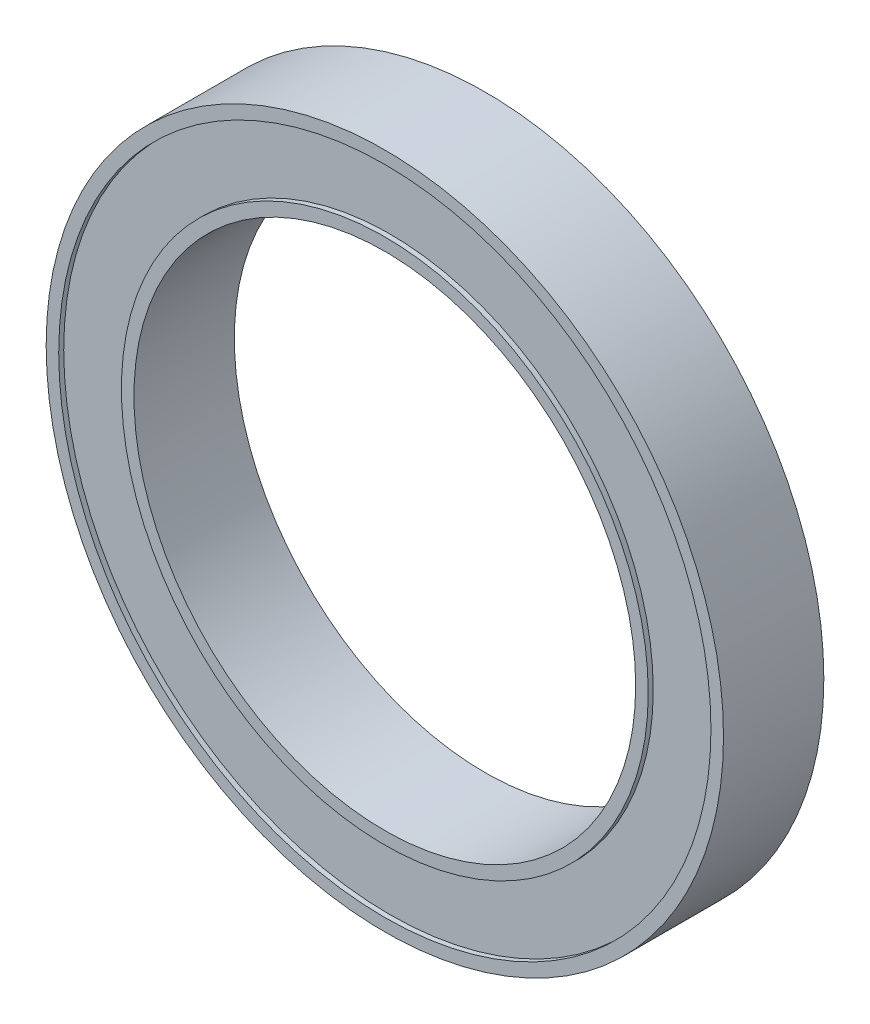
ISO-10303-21;
HEADER;
FILE_DESCRIPTION(('STEP AP214'),'2;1');
FILE_NAME('part.step','',(''),(''),'','','');
FILE_SCHEMA(('AUTOMOTIVE_DESIGN { 1 0 10303 214 1 1 1 1 }'));
ENDSEC;
DATA;
#1=APPLICATION_CONTEXT('core data for automotive mechanical design processes');
#2=APPLICATION_PROTOCOL_DEFINITION('international standard','automotive_design',2000,#1);
#3=PRODUCT_CONTEXT('',#1,'mechanical');
#4=PRODUCT('Part','Part','',(#3));
#5=PRODUCT_RELATED_PRODUCT_CATEGORY('part','',(#4));
#6=PRODUCT_DEFINITION_FORMATION('','',#4);
#7=PRODUCT_DEFINITION_CONTEXT('part definition',#1,'design');
#8=PRODUCT_DEFINITION('design','',#6,#7);
#9=PRODUCT_DEFINITION_SHAPE('','',#8);
#10=(LENGTH_UNIT() NAMED_UNIT(*) SI_UNIT(.MILLI.,.METRE.));
#11=(NAMED_UNIT(*) PLANE_ANGLE_UNIT() SI_UNIT($,.RADIAN.));
#12=(NAMED_UNIT(*) SI_UNIT($,.STERADIAN.) SOLID_ANGLE_UNIT());
#13=UNCERTAINTY_MEASURE_WITH_UNIT(LENGTH_MEASURE(1.E-05),#10,'distance_accuracy_value','');
#14=(GEOMETRIC_REPRESENTATION_CONTEXT(3) GLOBAL_UNCERTAINTY_ASSIGNED_CONTEXT((#13)) GLOBAL_UNIT_ASSIGNED_CONTEXT((#10,
#11,#12)) REPRESENTATION_CONTEXT('',''));
#15=CARTESIAN_POINT('',(0.,0.,0.));
#16=DIRECTION('',(0.,0.,1.));
#17=DIRECTION('',(1.,0.,0.));
#18=AXIS2_PLACEMENT_3D('',#15,#16,#17);
#19=CARTESIAN_POINT('',(0.,0.,4.));
#20=DIRECTION('',(0.,0.,-1.));
#21=DIRECTION('',(-1.,0.,0.));
#22=AXIS2_PLACEMENT_3D('',#19,#20,#21);
#23=CYLINDRICAL_SURFACE('',#22,10.5);
#24=CARTESIAN_POINT('',(0.,0.,0.));
#25=DIRECTION('',(0.,0.,1.));
#26=DIRECTION('',(1.,0.,0.));
#27=AXIS2_PLACEMENT_3D('',#24,#25,#26);
#28=CIRCLE('',#27,10.5);
#29=CARTESIAN_POINT('',(10.5,0.,0.));
#30=VERTEX_POINT('',#29);
#31=EDGE_CURVE('E53',#30,#30,#28,.T.);
#32=ORIENTED_EDGE('',*,*,#31,.T.);
#33=EDGE_LOOP('',(#32));
#34=FACE_BOUND('',#33,.T.);
#35=CARTESIAN_POINT('',(0.,0.,0.2));
#36=DIRECTION('',(0.,0.,1.));
#37=DIRECTION('',(1.,0.,0.));
#38=AXIS2_PLACEMENT_3D('',#35,#36,#37);
#39=CIRCLE('',#38,10.5);
#40=CARTESIAN_POINT('',(10.5,0.,0.2));
#41=VERTEX_POINT('',#40);
#42=EDGE_CURVE('E11',#41,#41,#39,.T.);
#43=ORIENTED_EDGE('',*,*,#42,.F.);
#44=EDGE_LOOP('',(#43));
#45=FACE_BOUND('',#44,.T.);
#46=ADVANCED_FACE('F37',(#34,#45),#23,.T.);
#47=CARTESIAN_POINT('',(0.,0.,4.));
#48=DIRECTION('',(0.,0.,-1.));
#49=DIRECTION('',(-1.,0.,0.));
#50=AXIS2_PLACEMENT_3D('',#47,#48,#49);
#51=CYLINDRICAL_SURFACE('',#50,10.);
#52=CARTESIAN_POINT('',(0.,0.,4.));
#53=DIRECTION('',(0.,0.,1.));
#54=DIRECTION('',(1.,0.,0.));
#55=AXIS2_PLACEMENT_3D('',#52,#53,#54);
#56=CIRCLE('',#55,10.);
#57=CARTESIAN_POINT('',(10.,0.,4.));
#58=VERTEX_POINT('',#57);
#59=EDGE_CURVE('E48',#58,#58,#56,.T.);
#60=ORIENTED_EDGE('',*,*,#59,.T.);
#61=EDGE_LOOP('',(#60));
#62=FACE_BOUND('',#61,.T.);
#63=CARTESIAN_POINT('',(0.,0.,0.));
#64=DIRECTION('',(0.,0.,1.));
#65=DIRECTION('',(1.,0.,0.));
#66=AXIS2_PLACEMENT_3D('',#63,#64,#65);
#67=CIRCLE('',#66,10.);
#68=CARTESIAN_POINT('',(10.,0.,0.));
#69=VERTEX_POINT('',#68);
#70=EDGE_CURVE('E57',#69,#69,#67,.T.);
#71=ORIENTED_EDGE('',*,*,#70,.F.);
#72=EDGE_LOOP('',(#71));
#73=FACE_BOUND('',#72,.T.);
#74=ADVANCED_FACE('F39',(#62,#73),#51,.F.);
#75=CARTESIAN_POINT('',(0.,0.,3.8));
#76=DIRECTION('',(0.,0.,1.));
#77=DIRECTION('',(1.,0.,0.));
#78=AXIS2_PLACEMENT_3D('',#75,#76,#77);
#79=CIRCLE('',#78,10.5);
#80=CARTESIAN_POINT('',(10.5,0.,3.8));
#81=VERTEX_POINT('',#80);
#82=EDGE_CURVE('E59',#81,#81,#79,.T.);
#83=ORIENTED_EDGE('',*,*,#82,.T.);
#84=EDGE_LOOP('',(#83));
#85=FACE_BOUND('',#84,.T.);
#86=CARTESIAN_POINT('',(0.,0.,4.));
#87=DIRECTION('',(0.,0.,1.));
#88=DIRECTION('',(1.,0.,0.));
#89=AXIS2_PLACEMENT_3D('',#86,#87,#88);
#90=CIRCLE('',#89,10.5);
#91=CARTESIAN_POINT('',(10.5,0.,4.));
#92=VERTEX_POINT('',#91);
#93=EDGE_CURVE('E44',#92,#92,#90,.T.);
#94=ORIENTED_EDGE('',*,*,#93,.F.);
#95=EDGE_LOOP('',(#94));
#96=FACE_BOUND('',#95,.T.);
#97=ADVANCED_FACE('F78',(#85,#96),#23,.T.);
#98=CARTESIAN_POINT('',(0.,0.,4.));
#99=DIRECTION('',(0.,0.,1.));
#100=DIRECTION('',(1.,0.,0.));
#101=AXIS2_PLACEMENT_3D('',#98,#99,#100);
#102=PLANE('',#101);
#103=ORIENTED_EDGE('',*,*,#59,.F.);
#104=EDGE_LOOP('',(#103));
#105=FACE_BOUND('',#104,.T.);
#106=ORIENTED_EDGE('',*,*,#93,.T.);
#107=EDGE_LOOP('',(#106));
#108=FACE_BOUND('',#107,.T.);
#109=ADVANCED_FACE('F68',(#105,#108),#102,.T.);
#110=CARTESIAN_POINT('',(0.,0.,0.));
#111=DIRECTION('',(0.,0.,1.));
#112=DIRECTION('',(1.,0.,0.));
#113=AXIS2_PLACEMENT_3D('',#110,#111,#112);
#114=PLANE('',#113);
#115=ORIENTED_EDGE('',*,*,#70,.T.);
#116=EDGE_LOOP('',(#115));
#117=FACE_BOUND('',#116,.T.);
#118=ORIENTED_EDGE('',*,*,#31,.F.);
#119=EDGE_LOOP('',(#118));
#120=FACE_BOUND('',#119,.T.);
#121=ADVANCED_FACE('F65',(#117,#120),#114,.F.);
#122=CARTESIAN_POINT('',(0.,0.,3.8));
#123=DIRECTION('',(0.,0.,1.));
#124=DIRECTION('',(1.,0.,0.));
#125=AXIS2_PLACEMENT_3D('',#122,#123,#124);
#126=PLANE('',#125);
#127=ORIENTED_EDGE('',*,*,#82,.F.);
#128=EDGE_LOOP('',(#127));
#129=FACE_BOUND('',#128,.T.);
#130=CARTESIAN_POINT('',(0.,0.,3.8));
#131=DIRECTION('',(0.,0.,1.));
#132=DIRECTION('',(1.,0.,0.));
#133=AXIS2_PLACEMENT_3D('',#130,#131,#132);
#134=CIRCLE('',#133,13.);
#135=CARTESIAN_POINT('',(13.,0.,3.8));
#136=VERTEX_POINT('',#135);
#137=EDGE_CURVE('E96',#136,#136,#134,.F.);
#138=ORIENTED_EDGE('',*,*,#137,.F.);
#139=EDGE_LOOP('',(#138));
#140=FACE_BOUND('',#139,.T.);
#141=ADVANCED_FACE('F67',(#129,#140),#126,.T.);
#142=CARTESIAN_POINT('',(0.,0.,0.2));
#143=DIRECTION('',(0.,0.,1.));
#144=DIRECTION('',(1.,0.,0.));
#145=AXIS2_PLACEMENT_3D('',#142,#143,#144);
#146=PLANE('',#145);
#147=ORIENTED_EDGE('',*,*,#42,.T.);
#148=EDGE_LOOP('',(#147));
#149=FACE_BOUND('',#148,.T.);
#150=CARTESIAN_POINT('',(0.,0.,0.2));
#151=DIRECTION('',(0.,0.,1.));
#152=DIRECTION('',(1.,0.,0.));
#153=AXIS2_PLACEMENT_3D('',#150,#151,#152);
#154=CIRCLE('',#153,13.);
#155=CARTESIAN_POINT('',(13.,0.,0.2));
#156=VERTEX_POINT('',#155);
#157=EDGE_CURVE('E93',#156,#156,#154,.T.);
#158=ORIENTED_EDGE('',*,*,#157,.F.);
#159=EDGE_LOOP('',(#158));
#160=FACE_BOUND('',#159,.T.);
#161=ADVANCED_FACE('F75',(#149,#160),#146,.F.);
#162=CARTESIAN_POINT('',(0.,0.,4.));
#163=DIRECTION('',(0.,0.,-1.));
#164=DIRECTION('',(-1.,0.,0.));
#165=AXIS2_PLACEMENT_3D('',#162,#163,#164);
#166=CYLINDRICAL_SURFACE('',#165,13.);
#167=CARTESIAN_POINT('',(0.,0.,0.));
#168=DIRECTION('',(0.,0.,1.));
#169=DIRECTION('',(1.,0.,0.));
#170=AXIS2_PLACEMENT_3D('',#167,#168,#169);
#171=CIRCLE('',#170,13.);
#172=CARTESIAN_POINT('',(13.,0.,0.));
#173=VERTEX_POINT('',#172);
#174=EDGE_CURVE('E105',#173,#173,#171,.T.);
#175=ORIENTED_EDGE('',*,*,#174,.F.);
#176=EDGE_LOOP('',(#175));
#177=FACE_BOUND('',#176,.T.);
#178=ORIENTED_EDGE('',*,*,#157,.T.);
#179=EDGE_LOOP('',(#178));
#180=FACE_BOUND('',#179,.T.);
#181=ADVANCED_FACE('F135',(#177,#180),#166,.F.);
#182=ORIENTED_EDGE('',*,*,#137,.T.);
#183=EDGE_LOOP('',(#182));
#184=FACE_BOUND('',#183,.T.);
#185=CARTESIAN_POINT('',(0.,0.,4.));
#186=DIRECTION('',(0.,0.,1.));
#187=DIRECTION('',(1.,0.,0.));
#188=AXIS2_PLACEMENT_3D('',#185,#186,#187);
#189=CIRCLE('',#188,13.);
#190=CARTESIAN_POINT('',(13.,0.,4.));
#191=VERTEX_POINT('',#190);
#192=EDGE_CURVE('E104',#191,#191,#189,.T.);
#193=ORIENTED_EDGE('',*,*,#192,.T.);
#194=EDGE_LOOP('',(#193));
#195=FACE_BOUND('',#194,.T.);
#196=ADVANCED_FACE('F113',(#184,#195),#166,.F.);
#197=CARTESIAN_POINT('',(0.,0.,4.));
#198=DIRECTION('',(0.,0.,-1.));
#199=DIRECTION('',(-1.,0.,0.));
#200=AXIS2_PLACEMENT_3D('',#197,#198,#199);
#201=CYLINDRICAL_SURFACE('',#200,13.5);
#202=CARTESIAN_POINT('',(0.,0.,4.));
#203=DIRECTION('',(0.,0.,1.));
#204=DIRECTION('',(1.,0.,0.));
#205=AXIS2_PLACEMENT_3D('',#202,#203,#204);
#206=CIRCLE('',#205,13.5);
#207=CARTESIAN_POINT('',(13.5,0.,4.));
#208=VERTEX_POINT('',#207);
#209=EDGE_CURVE('E100',#208,#208,#206,.T.);
#210=ORIENTED_EDGE('',*,*,#209,.F.);
#211=EDGE_LOOP('',(#210));
#212=FACE_BOUND('',#211,.T.);
#213=CARTESIAN_POINT('',(0.,0.,0.));
#214=DIRECTION('',(0.,0.,1.));
#215=DIRECTION('',(1.,0.,0.));
#216=AXIS2_PLACEMENT_3D('',#213,#214,#215);
#217=CIRCLE('',#216,13.5);
#218=CARTESIAN_POINT('',(13.5,0.,0.));
#219=VERTEX_POINT('',#218);
#220=EDGE_CURVE('E101',#219,#219,#217,.T.);
#221=ORIENTED_EDGE('',*,*,#220,.T.);
#222=EDGE_LOOP('',(#221));
#223=FACE_BOUND('',#222,.T.);
#224=ADVANCED_FACE('F119',(#212,#223),#201,.T.);
#225=CARTESIAN_POINT('',(0.,0.,4.));
#226=DIRECTION('',(0.,0.,1.));
#227=DIRECTION('',(1.,0.,0.));
#228=AXIS2_PLACEMENT_3D('',#225,#226,#227);
#229=PLANE('',#228);
#230=ORIENTED_EDGE('',*,*,#192,.F.);
#231=EDGE_LOOP('',(#230));
#232=FACE_BOUND('',#231,.T.);
#233=ORIENTED_EDGE('',*,*,#209,.T.);
#234=EDGE_LOOP('',(#233));
#235=FACE_BOUND('',#234,.T.);
#236=ADVANCED_FACE('F115',(#232,#235),#229,.T.);
#237=CARTESIAN_POINT('',(0.,0.,0.));
#238=DIRECTION('',(0.,0.,1.));
#239=DIRECTION('',(1.,0.,0.));
#240=AXIS2_PLACEMENT_3D('',#237,#238,#239);
#241=PLANE('',#240);
#242=ORIENTED_EDGE('',*,*,#174,.T.);
#243=EDGE_LOOP('',(#242));
#244=FACE_BOUND('',#243,.T.);
#245=ORIENTED_EDGE('',*,*,#220,.F.);
#246=EDGE_LOOP('',(#245));
#247=FACE_BOUND('',#246,.T.);
#248=ADVANCED_FACE('F118',(#244,#247),#241,.F.);
#249=CLOSED_SHELL('',(#46,#74,#97,#109,#121,#141,#161,#181,#196,#224,#236,#248));
#250=MANIFOLD_SOLID_BREP('B2',#249);
#251=ADVANCED_BREP_SHAPE_REPRESENTATION('',(#18,#250),#14);
#252=SHAPE_DEFINITION_REPRESENTATION(#9,#251);
ENDSEC;
END-ISO-10303-21;
